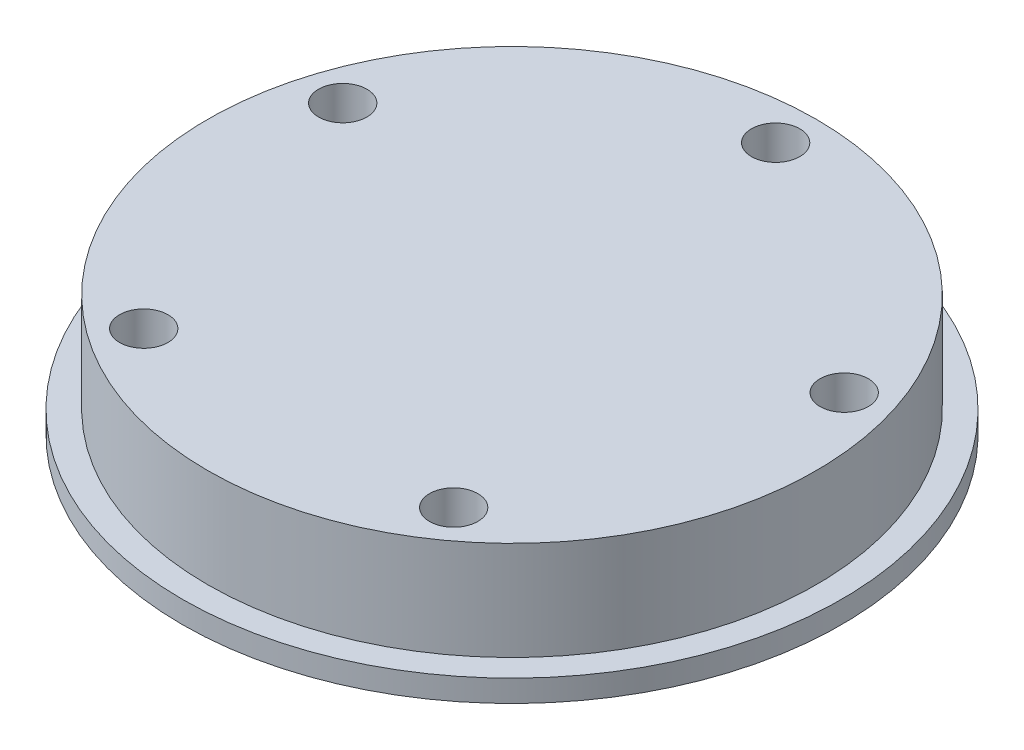
ISO-10303-21;
HEADER;
FILE_DESCRIPTION(('STEP AP214'),'2;1');
FILE_NAME('part.step','',(''),(''),'','','');
FILE_SCHEMA(('AUTOMOTIVE_DESIGN { 1 0 10303 214 1 1 1 1 }'));
ENDSEC;
DATA;
#1=APPLICATION_CONTEXT('core data for automotive mechanical design processes');
#2=APPLICATION_PROTOCOL_DEFINITION('international standard','automotive_design',2000,#1);
#3=PRODUCT_CONTEXT('',#1,'mechanical');
#4=PRODUCT('Part','Part','',(#3));
#5=PRODUCT_RELATED_PRODUCT_CATEGORY('part','',(#4));
#6=PRODUCT_DEFINITION_FORMATION('','',#4);
#7=PRODUCT_DEFINITION_CONTEXT('part definition',#1,'design');
#8=PRODUCT_DEFINITION('design','',#6,#7);
#9=PRODUCT_DEFINITION_SHAPE('','',#8);
#10=(LENGTH_UNIT() NAMED_UNIT(*) SI_UNIT(.MILLI.,.METRE.));
#11=(NAMED_UNIT(*) PLANE_ANGLE_UNIT() SI_UNIT($,.RADIAN.));
#12=(NAMED_UNIT(*) SI_UNIT($,.STERADIAN.) SOLID_ANGLE_UNIT());
#13=UNCERTAINTY_MEASURE_WITH_UNIT(LENGTH_MEASURE(1.E-05),#10,'distance_accuracy_value','');
#14=(GEOMETRIC_REPRESENTATION_CONTEXT(3) GLOBAL_UNCERTAINTY_ASSIGNED_CONTEXT((#13)) GLOBAL_UNIT_ASSIGNED_CONTEXT((#10,
#11,#12)) REPRESENTATION_CONTEXT('',''));
#15=CARTESIAN_POINT('',(0.,0.,0.));
#16=DIRECTION('',(0.,0.,1.));
#17=DIRECTION('',(1.,0.,0.));
#18=AXIS2_PLACEMENT_3D('',#15,#16,#17);
#19=CARTESIAN_POINT('',(0.,11.,0.));
#20=DIRECTION('',(0.,-1.,0.));
#21=DIRECTION('',(0.,0.,-1.));
#22=AXIS2_PLACEMENT_3D('',#19,#20,#21);
#23=CYLINDRICAL_SURFACE('',#22,27.7);
#24=CARTESIAN_POINT('',(0.,2.,0.));
#25=DIRECTION('',(0.,1.,0.));
#26=DIRECTION('',(0.,0.,1.));
#27=AXIS2_PLACEMENT_3D('',#24,#25,#26);
#28=CIRCLE('',#27,27.7);
#29=CARTESIAN_POINT('',(0.,2.,27.7));
#30=VERTEX_POINT('',#29);
#31=EDGE_CURVE('E46',#30,#30,#28,.T.);
#32=ORIENTED_EDGE('',*,*,#31,.T.);
#33=EDGE_LOOP('',(#32));
#34=FACE_BOUND('',#33,.T.);
#35=CARTESIAN_POINT('',(0.,11.,0.));
#36=DIRECTION('',(0.,1.,0.));
#37=DIRECTION('',(0.,0.,1.));
#38=AXIS2_PLACEMENT_3D('',#35,#36,#37);
#39=CIRCLE('',#38,27.7);
#40=CARTESIAN_POINT('',(0.,11.,27.7));
#41=VERTEX_POINT('',#40);
#42=EDGE_CURVE('E10',#41,#41,#39,.T.);
#43=ORIENTED_EDGE('',*,*,#42,.F.);
#44=EDGE_LOOP('',(#43));
#45=FACE_BOUND('',#44,.T.);
#46=ADVANCED_FACE('F43',(#34,#45),#23,.T.);
#47=CARTESIAN_POINT('',(0.,11.,0.));
#48=DIRECTION('',(0.,1.,0.));
#49=DIRECTION('',(0.,0.,1.));
#50=AXIS2_PLACEMENT_3D('',#47,#48,#49);
#51=PLANE('',#50);
#52=CARTESIAN_POINT('',(0.,11.,-24.));
#53=DIRECTION('',(0.,1.,0.));
#54=DIRECTION('',(0.,0.,1.));
#55=AXIS2_PLACEMENT_3D('',#52,#53,#54);
#56=CIRCLE('',#55,2.2);
#57=CARTESIAN_POINT('',(0.,11.,-21.8));
#58=VERTEX_POINT('',#57);
#59=EDGE_CURVE('E97',#58,#58,#56,.T.);
#60=ORIENTED_EDGE('',*,*,#59,.F.);
#61=EDGE_LOOP('',(#60));
#62=FACE_BOUND('',#61,.T.);
#63=CARTESIAN_POINT('',(22.8253563910837,11.,-7.41640786499874));
#64=DIRECTION('',(0.,1.,0.));
#65=DIRECTION('',(0.,0.,1.));
#66=AXIS2_PLACEMENT_3D('',#63,#64,#65);
#67=CIRCLE('',#66,2.2);
#68=CARTESIAN_POINT('',(22.8253563910837,11.,-5.21640786499874));
#69=VERTEX_POINT('',#68);
#70=EDGE_CURVE('E93',#69,#69,#67,.T.);
#71=ORIENTED_EDGE('',*,*,#70,.F.);
#72=EDGE_LOOP('',(#71));
#73=FACE_BOUND('',#72,.T.);
#74=CARTESIAN_POINT('',(14.1068460550194,11.,19.4164078649987));
#75=DIRECTION('',(0.,1.,0.));
#76=DIRECTION('',(0.,0.,1.));
#77=AXIS2_PLACEMENT_3D('',#74,#75,#76);
#78=CIRCLE('',#77,2.2);
#79=CARTESIAN_POINT('',(14.1068460550194,11.,21.6164078649987));
#80=VERTEX_POINT('',#79);
#81=EDGE_CURVE('E85',#80,#80,#78,.T.);
#82=ORIENTED_EDGE('',*,*,#81,.F.);
#83=EDGE_LOOP('',(#82));
#84=FACE_BOUND('',#83,.T.);
#85=CARTESIAN_POINT('',(-14.1068460550194,11.,19.4164078649987));
#86=DIRECTION('',(0.,1.,0.));
#87=DIRECTION('',(0.,0.,1.));
#88=AXIS2_PLACEMENT_3D('',#85,#86,#87);
#89=CIRCLE('',#88,2.2);
#90=CARTESIAN_POINT('',(-14.1068460550194,11.,21.6164078649987));
#91=VERTEX_POINT('',#90);
#92=EDGE_CURVE('E77',#91,#91,#89,.T.);
#93=ORIENTED_EDGE('',*,*,#92,.F.);
#94=EDGE_LOOP('',(#93));
#95=FACE_BOUND('',#94,.T.);
#96=CARTESIAN_POINT('',(-22.8253563910837,11.,-7.41640786499873));
#97=DIRECTION('',(0.,1.,0.));
#98=DIRECTION('',(0.,0.,1.));
#99=AXIS2_PLACEMENT_3D('',#96,#97,#98);
#100=CIRCLE('',#99,2.2);
#101=CARTESIAN_POINT('',(-22.8253563910837,11.,-5.21640786499873));
#102=VERTEX_POINT('',#101);
#103=EDGE_CURVE('E69',#102,#102,#100,.T.);
#104=ORIENTED_EDGE('',*,*,#103,.F.);
#105=EDGE_LOOP('',(#104));
#106=FACE_BOUND('',#105,.T.);
#107=ORIENTED_EDGE('',*,*,#42,.T.);
#108=EDGE_LOOP('',(#107));
#109=FACE_BOUND('',#108,.T.);
#110=ADVANCED_FACE('F115',(#62,#73,#84,#95,#106,#109),#51,.T.);
#111=CARTESIAN_POINT('',(0.,2.,0.));
#112=DIRECTION('',(0.,-1.,0.));
#113=DIRECTION('',(0.,0.,-1.));
#114=AXIS2_PLACEMENT_3D('',#111,#112,#113);
#115=CYLINDRICAL_SURFACE('',#114,30.);
#116=CARTESIAN_POINT('',(0.,2.,0.));
#117=DIRECTION('',(0.,1.,0.));
#118=DIRECTION('',(0.,0.,1.));
#119=AXIS2_PLACEMENT_3D('',#116,#117,#118);
#120=CIRCLE('',#119,30.);
#121=CARTESIAN_POINT('',(0.,2.,30.));
#122=VERTEX_POINT('',#121);
#123=EDGE_CURVE('E56',#122,#122,#120,.T.);
#124=ORIENTED_EDGE('',*,*,#123,.F.);
#125=EDGE_LOOP('',(#124));
#126=FACE_BOUND('',#125,.T.);
#127=CARTESIAN_POINT('',(0.,0.,0.));
#128=DIRECTION('',(0.,1.,0.));
#129=DIRECTION('',(0.,0.,1.));
#130=AXIS2_PLACEMENT_3D('',#127,#128,#129);
#131=CIRCLE('',#130,30.);
#132=CARTESIAN_POINT('',(0.,0.,30.));
#133=VERTEX_POINT('',#132);
#134=EDGE_CURVE('E58',#133,#133,#131,.T.);
#135=ORIENTED_EDGE('',*,*,#134,.T.);
#136=EDGE_LOOP('',(#135));
#137=FACE_BOUND('',#136,.T.);
#138=ADVANCED_FACE('F118',(#126,#137),#115,.T.);
#139=CARTESIAN_POINT('',(0.,2.,0.));
#140=DIRECTION('',(0.,1.,0.));
#141=DIRECTION('',(0.,0.,1.));
#142=AXIS2_PLACEMENT_3D('',#139,#140,#141);
#143=PLANE('',#142);
#144=ORIENTED_EDGE('',*,*,#31,.F.);
#145=EDGE_LOOP('',(#144));
#146=FACE_BOUND('',#145,.T.);
#147=ORIENTED_EDGE('',*,*,#123,.T.);
#148=EDGE_LOOP('',(#147));
#149=FACE_BOUND('',#148,.T.);
#150=ADVANCED_FACE('F140',(#146,#149),#143,.T.);
#151=CARTESIAN_POINT('',(0.,0.,0.));
#152=DIRECTION('',(0.,1.,0.));
#153=DIRECTION('',(0.,0.,1.));
#154=AXIS2_PLACEMENT_3D('',#151,#152,#153);
#155=PLANE('',#154);
#156=CARTESIAN_POINT('',(0.,0.,-24.));
#157=DIRECTION('',(0.,1.,0.));
#158=DIRECTION('',(0.,0.,1.));
#159=AXIS2_PLACEMENT_3D('',#156,#157,#158);
#160=CIRCLE('',#159,2.2);
#161=CARTESIAN_POINT('',(0.,0.,-21.8));
#162=VERTEX_POINT('',#161);
#163=EDGE_CURVE('E62',#162,#162,#160,.T.);
#164=ORIENTED_EDGE('',*,*,#163,.T.);
#165=EDGE_LOOP('',(#164));
#166=FACE_BOUND('',#165,.T.);
#167=CARTESIAN_POINT('',(22.8253563910837,0.,-7.41640786499874));
#168=DIRECTION('',(0.,1.,0.));
#169=DIRECTION('',(0.,0.,1.));
#170=AXIS2_PLACEMENT_3D('',#167,#168,#169);
#171=CIRCLE('',#170,2.2);
#172=CARTESIAN_POINT('',(22.8253563910837,0.,-5.21640786499874));
#173=VERTEX_POINT('',#172);
#174=EDGE_CURVE('E89',#173,#173,#171,.T.);
#175=ORIENTED_EDGE('',*,*,#174,.T.);
#176=EDGE_LOOP('',(#175));
#177=FACE_BOUND('',#176,.T.);
#178=CARTESIAN_POINT('',(14.1068460550194,0.,19.4164078649987));
#179=DIRECTION('',(0.,1.,0.));
#180=DIRECTION('',(0.,0.,1.));
#181=AXIS2_PLACEMENT_3D('',#178,#179,#180);
#182=CIRCLE('',#181,2.2);
#183=CARTESIAN_POINT('',(14.1068460550194,0.,21.6164078649987));
#184=VERTEX_POINT('',#183);
#185=EDGE_CURVE('E81',#184,#184,#182,.T.);
#186=ORIENTED_EDGE('',*,*,#185,.T.);
#187=EDGE_LOOP('',(#186));
#188=FACE_BOUND('',#187,.T.);
#189=CARTESIAN_POINT('',(-14.1068460550194,0.,19.4164078649987));
#190=DIRECTION('',(0.,1.,0.));
#191=DIRECTION('',(0.,0.,1.));
#192=AXIS2_PLACEMENT_3D('',#189,#190,#191);
#193=CIRCLE('',#192,2.2);
#194=CARTESIAN_POINT('',(-14.1068460550194,0.,21.6164078649987));
#195=VERTEX_POINT('',#194);
#196=EDGE_CURVE('E73',#195,#195,#193,.T.);
#197=ORIENTED_EDGE('',*,*,#196,.T.);
#198=EDGE_LOOP('',(#197));
#199=FACE_BOUND('',#198,.T.);
#200=CARTESIAN_POINT('',(-22.8253563910837,0.,-7.41640786499873));
#201=DIRECTION('',(0.,1.,0.));
#202=DIRECTION('',(0.,0.,1.));
#203=AXIS2_PLACEMENT_3D('',#200,#201,#202);
#204=CIRCLE('',#203,2.2);
#205=CARTESIAN_POINT('',(-22.8253563910837,0.,-5.21640786499873));
#206=VERTEX_POINT('',#205);
#207=EDGE_CURVE('E65',#206,#206,#204,.T.);
#208=ORIENTED_EDGE('',*,*,#207,.T.);
#209=EDGE_LOOP('',(#208));
#210=FACE_BOUND('',#209,.T.);
#211=ORIENTED_EDGE('',*,*,#134,.F.);
#212=EDGE_LOOP('',(#211));
#213=FACE_BOUND('',#212,.T.);
#214=ADVANCED_FACE('F105',(#166,#177,#188,#199,#210,#213),#155,.F.);
#215=CARTESIAN_POINT('',(-22.8253563910837,0.,-7.41640786499873));
#216=DIRECTION('',(0.,1.,0.));
#217=DIRECTION('',(0.,0.,1.));
#218=AXIS2_PLACEMENT_3D('',#215,#216,#217);
#219=CYLINDRICAL_SURFACE('',#218,2.2);
#220=ORIENTED_EDGE('',*,*,#207,.F.);
#221=EDGE_LOOP('',(#220));
#222=FACE_BOUND('',#221,.T.);
#223=ORIENTED_EDGE('',*,*,#103,.T.);
#224=EDGE_LOOP('',(#223));
#225=FACE_BOUND('',#224,.T.);
#226=ADVANCED_FACE('F128',(#222,#225),#219,.F.);
#227=CARTESIAN_POINT('',(-14.1068460550194,0.,19.4164078649987));
#228=DIRECTION('',(0.,1.,0.));
#229=DIRECTION('',(0.,0.,1.));
#230=AXIS2_PLACEMENT_3D('',#227,#228,#229);
#231=CYLINDRICAL_SURFACE('',#230,2.2);
#232=ORIENTED_EDGE('',*,*,#196,.F.);
#233=EDGE_LOOP('',(#232));
#234=FACE_BOUND('',#233,.T.);
#235=ORIENTED_EDGE('',*,*,#92,.T.);
#236=EDGE_LOOP('',(#235));
#237=FACE_BOUND('',#236,.T.);
#238=ADVANCED_FACE('F130',(#234,#237),#231,.F.);
#239=CARTESIAN_POINT('',(14.1068460550194,0.,19.4164078649987));
#240=DIRECTION('',(0.,1.,0.));
#241=DIRECTION('',(0.,0.,1.));
#242=AXIS2_PLACEMENT_3D('',#239,#240,#241);
#243=CYLINDRICAL_SURFACE('',#242,2.2);
#244=ORIENTED_EDGE('',*,*,#185,.F.);
#245=EDGE_LOOP('',(#244));
#246=FACE_BOUND('',#245,.T.);
#247=ORIENTED_EDGE('',*,*,#81,.T.);
#248=EDGE_LOOP('',(#247));
#249=FACE_BOUND('',#248,.T.);
#250=ADVANCED_FACE('F137',(#246,#249),#243,.F.);
#251=CARTESIAN_POINT('',(22.8253563910837,0.,-7.41640786499874));
#252=DIRECTION('',(0.,1.,0.));
#253=DIRECTION('',(0.,0.,1.));
#254=AXIS2_PLACEMENT_3D('',#251,#252,#253);
#255=CYLINDRICAL_SURFACE('',#254,2.2);
#256=ORIENTED_EDGE('',*,*,#174,.F.);
#257=EDGE_LOOP('',(#256));
#258=FACE_BOUND('',#257,.T.);
#259=ORIENTED_EDGE('',*,*,#70,.T.);
#260=EDGE_LOOP('',(#259));
#261=FACE_BOUND('',#260,.T.);
#262=ADVANCED_FACE('F111',(#258,#261),#255,.F.);
#263=CARTESIAN_POINT('',(0.,0.,-24.));
#264=DIRECTION('',(0.,1.,0.));
#265=DIRECTION('',(0.,0.,1.));
#266=AXIS2_PLACEMENT_3D('',#263,#264,#265);
#267=CYLINDRICAL_SURFACE('',#266,2.2);
#268=ORIENTED_EDGE('',*,*,#163,.F.);
#269=EDGE_LOOP('',(#268));
#270=FACE_BOUND('',#269,.T.);
#271=ORIENTED_EDGE('',*,*,#59,.T.);
#272=EDGE_LOOP('',(#271));
#273=FACE_BOUND('',#272,.T.);
#274=ADVANCED_FACE('F108',(#270,#273),#267,.F.);
#275=CLOSED_SHELL('',(#46,#110,#138,#150,#214,#226,#238,#250,#262,#274));
#276=MANIFOLD_SOLID_BREP('B2',#275);
#277=ADVANCED_BREP_SHAPE_REPRESENTATION('',(#18,#276),#14);
#278=SHAPE_DEFINITION_REPRESENTATION(#9,#277);
ENDSEC;
END-ISO-10303-21;
